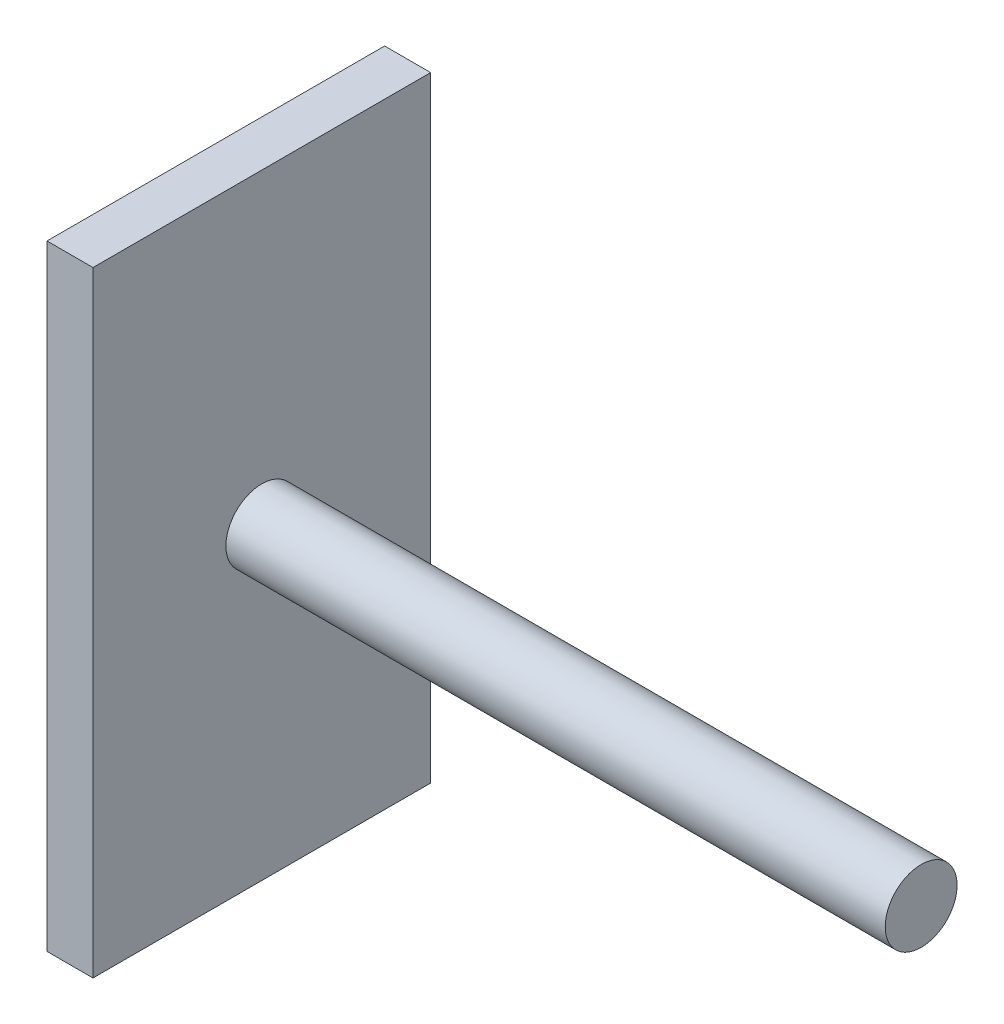
ISO-10303-21;
HEADER;
FILE_DESCRIPTION(('STEP AP214'),'2;1');
FILE_NAME('part.step','',(''),(''),'','','');
FILE_SCHEMA(('AUTOMOTIVE_DESIGN { 1 0 10303 214 1 1 1 1 }'));
ENDSEC;
DATA;
#1=APPLICATION_CONTEXT('core data for automotive mechanical design processes');
#2=APPLICATION_PROTOCOL_DEFINITION('international standard','automotive_design',2000,#1);
#3=PRODUCT_CONTEXT('',#1,'mechanical');
#4=PRODUCT('Part','Part','',(#3));
#5=PRODUCT_RELATED_PRODUCT_CATEGORY('part','',(#4));
#6=PRODUCT_DEFINITION_FORMATION('','',#4);
#7=PRODUCT_DEFINITION_CONTEXT('part definition',#1,'design');
#8=PRODUCT_DEFINITION('design','',#6,#7);
#9=PRODUCT_DEFINITION_SHAPE('','',#8);
#10=(LENGTH_UNIT() NAMED_UNIT(*) SI_UNIT(.MILLI.,.METRE.));
#11=(NAMED_UNIT(*) PLANE_ANGLE_UNIT() SI_UNIT($,.RADIAN.));
#12=(NAMED_UNIT(*) SI_UNIT($,.STERADIAN.) SOLID_ANGLE_UNIT());
#13=UNCERTAINTY_MEASURE_WITH_UNIT(LENGTH_MEASURE(1.E-05),#10,'distance_accuracy_value','');
#14=(GEOMETRIC_REPRESENTATION_CONTEXT(3) GLOBAL_UNCERTAINTY_ASSIGNED_CONTEXT((#13)) GLOBAL_UNIT_ASSIGNED_CONTEXT((#10,
#11,#12)) REPRESENTATION_CONTEXT('',''));
#15=CARTESIAN_POINT('',(0.,0.,0.));
#16=DIRECTION('',(0.,0.,1.));
#17=DIRECTION('',(1.,0.,0.));
#18=AXIS2_PLACEMENT_3D('',#15,#16,#17);
#19=CARTESIAN_POINT('',(1.87,0.,-13.72));
#20=DIRECTION('',(0.,0.,1.));
#21=DIRECTION('',(1.,0.,0.));
#22=AXIS2_PLACEMENT_3D('',#19,#20,#21);
#23=PLANE('',#22);
#24=DIRECTION('',(0.,1.,0.));
#25=VECTOR('',#24,1.);
#26=CARTESIAN_POINT('',(0.,0.,-13.72));
#27=LINE('',#26,#25);
#28=CARTESIAN_POINT('',(0.,0.,-13.72));
#29=VERTEX_POINT('',#28);
#30=CARTESIAN_POINT('',(0.,25.,-13.72));
#31=VERTEX_POINT('',#30);
#32=EDGE_CURVE('E99',#29,#31,#27,.T.);
#33=ORIENTED_EDGE('',*,*,#32,.T.);
#34=DIRECTION('',(-1.,0.,0.));
#35=VECTOR('',#34,1.);
#36=CARTESIAN_POINT('',(1.87,25.,-13.72));
#37=LINE('',#36,#35);
#38=CARTESIAN_POINT('',(1.87,25.,-13.72));
#39=VERTEX_POINT('',#38);
#40=EDGE_CURVE('E11',#39,#31,#37,.T.);
#41=ORIENTED_EDGE('',*,*,#40,.F.);
#42=DIRECTION('',(0.,1.,0.));
#43=VECTOR('',#42,1.);
#44=CARTESIAN_POINT('',(1.87,0.,-13.72));
#45=LINE('',#44,#43);
#46=CARTESIAN_POINT('',(1.87,0.,-13.72));
#47=VERTEX_POINT('',#46);
#48=EDGE_CURVE('E84',#47,#39,#45,.T.);
#49=ORIENTED_EDGE('',*,*,#48,.F.);
#50=DIRECTION('',(-1.,0.,0.));
#51=VECTOR('',#50,1.);
#52=CARTESIAN_POINT('',(1.87,0.,-13.72));
#53=LINE('',#52,#51);
#54=EDGE_CURVE('E95',#47,#29,#53,.T.);
#55=ORIENTED_EDGE('',*,*,#54,.T.);
#56=EDGE_LOOP('',(#33,#41,#49,#55));
#57=FACE_BOUND('',#56,.T.);
#58=ADVANCED_FACE('F37',(#57),#23,.F.);
#59=CARTESIAN_POINT('',(1.87,25.,-13.72));
#60=DIRECTION('',(0.,-1.,0.));
#61=DIRECTION('',(0.,0.,-1.));
#62=AXIS2_PLACEMENT_3D('',#59,#60,#61);
#63=PLANE('',#62);
#64=DIRECTION('',(0.,0.,1.));
#65=VECTOR('',#64,1.);
#66=CARTESIAN_POINT('',(0.,25.,-13.72));
#67=LINE('',#66,#65);
#68=CARTESIAN_POINT('',(0.,25.,0.));
#69=VERTEX_POINT('',#68);
#70=EDGE_CURVE('E89',#31,#69,#67,.T.);
#71=ORIENTED_EDGE('',*,*,#70,.T.);
#72=DIRECTION('',(-1.,0.,0.));
#73=VECTOR('',#72,1.);
#74=CARTESIAN_POINT('',(1.87,25.,0.));
#75=LINE('',#74,#73);
#76=CARTESIAN_POINT('',(1.87,25.,0.));
#77=VERTEX_POINT('',#76);
#78=EDGE_CURVE('E45',#77,#69,#75,.T.);
#79=ORIENTED_EDGE('',*,*,#78,.F.);
#80=DIRECTION('',(0.,0.,1.));
#81=VECTOR('',#80,1.);
#82=CARTESIAN_POINT('',(1.87,25.,-13.72));
#83=LINE('',#82,#81);
#84=EDGE_CURVE('E79',#39,#77,#83,.T.);
#85=ORIENTED_EDGE('',*,*,#84,.F.);
#86=ORIENTED_EDGE('',*,*,#40,.T.);
#87=EDGE_LOOP('',(#71,#79,#85,#86));
#88=FACE_BOUND('',#87,.T.);
#89=ADVANCED_FACE('F88',(#88),#63,.F.);
#90=CARTESIAN_POINT('',(1.87,0.,0.));
#91=DIRECTION('',(0.,0.,1.));
#92=DIRECTION('',(1.,0.,0.));
#93=AXIS2_PLACEMENT_3D('',#90,#91,#92);
#94=PLANE('',#93);
#95=DIRECTION('',(0.,1.,0.));
#96=VECTOR('',#95,1.);
#97=CARTESIAN_POINT('',(0.,0.,0.));
#98=LINE('',#97,#96);
#99=CARTESIAN_POINT('',(0.,0.,0.));
#100=VERTEX_POINT('',#99);
#101=EDGE_CURVE('E104',#100,#69,#98,.T.);
#102=ORIENTED_EDGE('',*,*,#101,.F.);
#103=DIRECTION('',(-1.,0.,0.));
#104=VECTOR('',#103,1.);
#105=CARTESIAN_POINT('',(1.87,0.,0.));
#106=LINE('',#105,#104);
#107=CARTESIAN_POINT('',(1.87,0.,0.));
#108=VERTEX_POINT('',#107);
#109=EDGE_CURVE('E69',#108,#100,#106,.T.);
#110=ORIENTED_EDGE('',*,*,#109,.F.);
#111=DIRECTION('',(0.,1.,0.));
#112=VECTOR('',#111,1.);
#113=CARTESIAN_POINT('',(1.87,0.,0.));
#114=LINE('',#113,#112);
#115=EDGE_CURVE('E82',#108,#77,#114,.T.);
#116=ORIENTED_EDGE('',*,*,#115,.T.);
#117=ORIENTED_EDGE('',*,*,#78,.T.);
#118=EDGE_LOOP('',(#102,#110,#116,#117));
#119=FACE_BOUND('',#118,.T.);
#120=ADVANCED_FACE('F93',(#119),#94,.T.);
#121=CARTESIAN_POINT('',(1.87,0.,0.));
#122=DIRECTION('',(0.,1.,0.));
#123=DIRECTION('',(0.,0.,1.));
#124=AXIS2_PLACEMENT_3D('',#121,#122,#123);
#125=PLANE('',#124);
#126=DIRECTION('',(0.,0.,-1.));
#127=VECTOR('',#126,1.);
#128=CARTESIAN_POINT('',(0.,0.,0.));
#129=LINE('',#128,#127);
#130=EDGE_CURVE('E72',#100,#29,#129,.T.);
#131=ORIENTED_EDGE('',*,*,#130,.T.);
#132=ORIENTED_EDGE('',*,*,#54,.F.);
#133=DIRECTION('',(0.,0.,-1.));
#134=VECTOR('',#133,1.);
#135=CARTESIAN_POINT('',(1.87,0.,0.));
#136=LINE('',#135,#134);
#137=EDGE_CURVE('E53',#108,#47,#136,.T.);
#138=ORIENTED_EDGE('',*,*,#137,.F.);
#139=ORIENTED_EDGE('',*,*,#109,.T.);
#140=EDGE_LOOP('',(#131,#132,#138,#139));
#141=FACE_BOUND('',#140,.T.);
#142=ADVANCED_FACE('F123',(#141),#125,.F.);
#143=CARTESIAN_POINT('',(1.87,0.,0.));
#144=DIRECTION('',(1.,0.,0.));
#145=DIRECTION('',(0.,0.,-1.));
#146=AXIS2_PLACEMENT_3D('',#143,#144,#145);
#147=PLANE('',#146);
#148=CARTESIAN_POINT('',(1.87,12.5,-6.86));
#149=DIRECTION('',(1.,0.,0.));
#150=DIRECTION('',(0.,0.,-1.));
#151=AXIS2_PLACEMENT_3D('',#148,#149,#150);
#152=CIRCLE('',#151,1.46);
#153=CARTESIAN_POINT('',(1.87,12.5,-5.4));
#154=VERTEX_POINT('',#153);
#155=EDGE_CURVE('E166',#154,#154,#152,.T.);
#156=ORIENTED_EDGE('',*,*,#155,.F.);
#157=EDGE_LOOP('',(#156));
#158=FACE_BOUND('',#157,.T.);
#159=ORIENTED_EDGE('',*,*,#48,.T.);
#160=ORIENTED_EDGE('',*,*,#84,.T.);
#161=ORIENTED_EDGE('',*,*,#115,.F.);
#162=ORIENTED_EDGE('',*,*,#137,.T.);
#163=EDGE_LOOP('',(#159,#160,#161,#162));
#164=FACE_BOUND('',#163,.T.);
#165=ADVANCED_FACE('F80',(#158,#164),#147,.T.);
#166=CARTESIAN_POINT('',(0.,0.,0.));
#167=DIRECTION('',(1.,0.,0.));
#168=DIRECTION('',(0.,0.,-1.));
#169=AXIS2_PLACEMENT_3D('',#166,#167,#168);
#170=PLANE('',#169);
#171=ORIENTED_EDGE('',*,*,#32,.F.);
#172=ORIENTED_EDGE('',*,*,#130,.F.);
#173=ORIENTED_EDGE('',*,*,#101,.T.);
#174=ORIENTED_EDGE('',*,*,#70,.F.);
#175=EDGE_LOOP('',(#171,#172,#173,#174));
#176=FACE_BOUND('',#175,.T.);
#177=ADVANCED_FACE('F111',(#176),#170,.F.);
#178=CARTESIAN_POINT('',(28.66,12.5,-6.86));
#179=DIRECTION('',(-1.,0.,0.));
#180=DIRECTION('',(0.,0.,1.));
#181=AXIS2_PLACEMENT_3D('',#178,#179,#180);
#182=CYLINDRICAL_SURFACE('',#181,1.46);
#183=CARTESIAN_POINT('',(28.66,12.5,-6.86));
#184=DIRECTION('',(1.,0.,0.));
#185=DIRECTION('',(0.,0.,-1.));
#186=AXIS2_PLACEMENT_3D('',#183,#184,#185);
#187=CIRCLE('',#186,1.46);
#188=CARTESIAN_POINT('',(28.66,12.5,-5.4));
#189=VERTEX_POINT('',#188);
#190=EDGE_CURVE('E102',#189,#189,#187,.T.);
#191=CARTESIAN_POINT('',(28.66,12.5,-5.4));
#192=CARTESIAN_POINT('',(28.3809375,12.5,-5.4));
#193=CARTESIAN_POINT('',(28.101875,12.5,-5.4));
#194=CARTESIAN_POINT('',(27.54375,12.5,-5.4));
#195=CARTESIAN_POINT('',(27.2646875,12.5,-5.4));
#196=CARTESIAN_POINT('',(26.7065625,12.5,-5.4));
#197=CARTESIAN_POINT('',(26.4275,12.5,-5.4));
#198=CARTESIAN_POINT('',(25.869375,12.5,-5.4));
#199=CARTESIAN_POINT('',(25.5903125,12.5,-5.4));
#200=CARTESIAN_POINT('',(25.0321875,12.5,-5.4));
#201=CARTESIAN_POINT('',(24.753125,12.5,-5.4));
#202=CARTESIAN_POINT('',(24.195,12.5,-5.4));
#203=CARTESIAN_POINT('',(23.9159375,12.5,-5.4));
#204=CARTESIAN_POINT('',(23.3578125,12.5,-5.4));
#205=CARTESIAN_POINT('',(23.07875,12.5,-5.4));
#206=CARTESIAN_POINT('',(22.520625,12.5,-5.4));
#207=CARTESIAN_POINT('',(22.2415625,12.5,-5.4));
#208=CARTESIAN_POINT('',(21.6834375,12.5,-5.4));
#209=CARTESIAN_POINT('',(21.404375,12.5,-5.4));
#210=CARTESIAN_POINT('',(20.84625,12.5,-5.4));
#211=CARTESIAN_POINT('',(20.5671875,12.5,-5.4));
#212=CARTESIAN_POINT('',(20.0090625,12.5,-5.4));
#213=CARTESIAN_POINT('',(19.73,12.5,-5.4));
#214=CARTESIAN_POINT('',(19.171875,12.5,-5.4));
#215=CARTESIAN_POINT('',(18.8928125,12.5,-5.4));
#216=CARTESIAN_POINT('',(18.3346875,12.5,-5.4));
#217=CARTESIAN_POINT('',(18.055625,12.5,-5.4));
#218=CARTESIAN_POINT('',(17.4975,12.5,-5.4));
#219=CARTESIAN_POINT('',(17.2184375,12.5,-5.4));
#220=CARTESIAN_POINT('',(16.6603125,12.5,-5.4));
#221=CARTESIAN_POINT('',(16.38125,12.5,-5.4));
#222=CARTESIAN_POINT('',(15.823125,12.5,-5.4));
#223=CARTESIAN_POINT('',(15.5440625,12.5,-5.4));
#224=CARTESIAN_POINT('',(14.9859375,12.5,-5.4));
#225=CARTESIAN_POINT('',(14.706875,12.5,-5.4));
#226=CARTESIAN_POINT('',(14.14875,12.5,-5.4));
#227=CARTESIAN_POINT('',(13.8696875,12.5,-5.4));
#228=CARTESIAN_POINT('',(13.3115625,12.5,-5.4));
#229=CARTESIAN_POINT('',(13.0325,12.5,-5.4));
#230=CARTESIAN_POINT('',(12.474375,12.5,-5.4));
#231=CARTESIAN_POINT('',(12.1953125,12.5,-5.4));
#232=CARTESIAN_POINT('',(11.6371875,12.5,-5.4));
#233=CARTESIAN_POINT('',(11.358125,12.5,-5.4));
#234=CARTESIAN_POINT('',(10.8,12.5,-5.4));
#235=CARTESIAN_POINT('',(10.5209375,12.5,-5.4));
#236=CARTESIAN_POINT('',(9.9628125,12.5,-5.4));
#237=CARTESIAN_POINT('',(9.68375,12.5,-5.4));
#238=CARTESIAN_POINT('',(9.125625,12.5,-5.4));
#239=CARTESIAN_POINT('',(8.8465625,12.5,-5.4));
#240=CARTESIAN_POINT('',(8.2884375,12.5,-5.4));
#241=CARTESIAN_POINT('',(8.009375,12.5,-5.4));
#242=CARTESIAN_POINT('',(7.45125,12.5,-5.4));
#243=CARTESIAN_POINT('',(7.1721875,12.5,-5.4));
#244=CARTESIAN_POINT('',(6.6140625,12.5,-5.4));
#245=CARTESIAN_POINT('',(6.335,12.5,-5.4));
#246=CARTESIAN_POINT('',(5.776875,12.5,-5.4));
#247=CARTESIAN_POINT('',(5.4978125,12.5,-5.4));
#248=CARTESIAN_POINT('',(4.9396875,12.5,-5.4));
#249=CARTESIAN_POINT('',(4.660625,12.5,-5.4));
#250=CARTESIAN_POINT('',(4.1025,12.5,-5.4));
#251=CARTESIAN_POINT('',(3.8234375,12.5,-5.4));
#252=CARTESIAN_POINT('',(3.2653125,12.5,-5.4));
#253=CARTESIAN_POINT('',(2.98625,12.5,-5.4));
#254=CARTESIAN_POINT('',(2.428125,12.5,-5.4));
#255=CARTESIAN_POINT('',(2.1490625,12.5,-5.4));
#256=CARTESIAN_POINT('',(1.87,12.5,-5.4));
#257=B_SPLINE_CURVE_WITH_KNOTS('',3,(#191,#192,#193,#194,#195,#196,#197,#198,#199,#200,#201,
#202,#203,#204,#205,#206,#207,#208,#209,#210,#211,#212,#213,#214,#215,#216,#217,#218,#219,#220,
#221,#222,#223,#224,#225,#226,#227,#228,#229,#230,#231,#232,#233,#234,#235,#236,#237,#238,#239,
#240,#241,#242,#243,#244,#245,#246,#247,#248,#249,#250,#251,#252,#253,#254,#255,#256),
.UNSPECIFIED.,.F.,.F.,(4,2,2,2,2,2,2,2,2,2,2,2,2,2,2,2,2,2,2,2,2,2,2,2,2,2,2,2,2,2,2,2,4),(0.,
0.837187500000003,1.674375,2.5115625,3.34875,4.1859375,5.023125,5.8603125,6.6975,7.5346875,
8.371875,9.2090625,10.04625,10.8834375,11.720625,12.5578125,13.395,14.2321875,15.069375,
15.9065625,16.74375,17.5809375,18.418125,19.2553125,20.0925,20.9296875,21.766875,22.6040625,
23.44125,24.2784375,25.115625,25.9528125,26.79),.UNSPECIFIED.);
#258=EDGE_CURVE('BSEAM113',#189,#154,#257,.T.);
#259=ORIENTED_EDGE('',*,*,#190,.F.);
#260=ORIENTED_EDGE('',*,*,#155,.T.);
#261=ORIENTED_EDGE('',*,*,#258,.T.);
#262=ORIENTED_EDGE('',*,*,#258,.F.);
#263=EDGE_LOOP('',(#259,#261,#260,#262));
#264=FACE_BOUND('',#263,.T.);
#265=ADVANCED_FACE('F113',(#264),#182,.T.);
#266=CARTESIAN_POINT('',(28.66,12.5,-6.86));
#267=DIRECTION('',(1.,0.,0.));
#268=DIRECTION('',(0.,0.,-1.));
#269=AXIS2_PLACEMENT_3D('',#266,#267,#268);
#270=PLANE('',#269);
#271=ORIENTED_EDGE('',*,*,#190,.T.);
#272=EDGE_LOOP('',(#271));
#273=FACE_BOUND('',#272,.T.);
#274=ADVANCED_FACE('F120',(#273),#270,.T.);
#275=CLOSED_SHELL('',(#58,#89,#120,#142,#165,#177,#265,#274));
#276=MANIFOLD_SOLID_BREP('B2',#275);
#277=ADVANCED_BREP_SHAPE_REPRESENTATION('',(#18,#276),#14);
#278=SHAPE_DEFINITION_REPRESENTATION(#9,#277);
ENDSEC;
END-ISO-10303-21;
